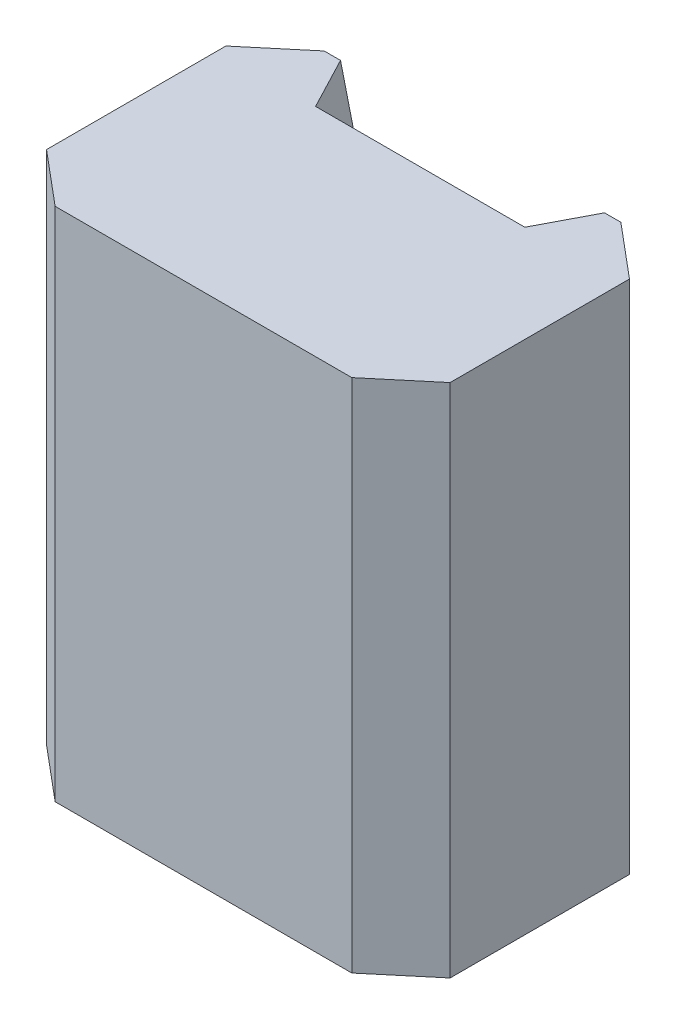
ISO-10303-21;
HEADER;
FILE_DESCRIPTION(('STEP AP214'),'2;1');
FILE_NAME('part.step','',(''),(''),'','','');
FILE_SCHEMA(('AUTOMOTIVE_DESIGN { 1 0 10303 214 1 1 1 1 }'));
ENDSEC;
DATA;
#1=APPLICATION_CONTEXT('core data for automotive mechanical design processes');
#2=APPLICATION_PROTOCOL_DEFINITION('international standard','automotive_design',2000,#1);
#3=PRODUCT_CONTEXT('',#1,'mechanical');
#4=PRODUCT('Part','Part','',(#3));
#5=PRODUCT_RELATED_PRODUCT_CATEGORY('part','',(#4));
#6=PRODUCT_DEFINITION_FORMATION('','',#4);
#7=PRODUCT_DEFINITION_CONTEXT('part definition',#1,'design');
#8=PRODUCT_DEFINITION('design','',#6,#7);
#9=PRODUCT_DEFINITION_SHAPE('','',#8);
#10=(LENGTH_UNIT() NAMED_UNIT(*) SI_UNIT(.MILLI.,.METRE.));
#11=(NAMED_UNIT(*) PLANE_ANGLE_UNIT() SI_UNIT($,.RADIAN.));
#12=(NAMED_UNIT(*) SI_UNIT($,.STERADIAN.) SOLID_ANGLE_UNIT());
#13=UNCERTAINTY_MEASURE_WITH_UNIT(LENGTH_MEASURE(1.E-05),#10,'distance_accuracy_value','');
#14=(GEOMETRIC_REPRESENTATION_CONTEXT(3) GLOBAL_UNCERTAINTY_ASSIGNED_CONTEXT((#13)) GLOBAL_UNIT_ASSIGNED_CONTEXT((#10,
#11,#12)) REPRESENTATION_CONTEXT('',''));
#15=CARTESIAN_POINT('',(0.,0.,0.));
#16=DIRECTION('',(0.,0.,1.));
#17=DIRECTION('',(1.,0.,0.));
#18=AXIS2_PLACEMENT_3D('',#15,#16,#17);
#19=CARTESIAN_POINT('',(135.,345.,90.));
#20=DIRECTION('',(-1.,0.,0.));
#21=DIRECTION('',(0.,0.,1.));
#22=AXIS2_PLACEMENT_3D('',#19,#20,#21);
#23=PLANE('',#22);
#24=DIRECTION('',(0.,0.,-1.));
#25=VECTOR('',#24,1.);
#26=CARTESIAN_POINT('',(135.,0.,90.));
#27=LINE('',#26,#25);
#28=CARTESIAN_POINT('',(135.,0.,60.));
#29=VERTEX_POINT('',#28);
#30=CARTESIAN_POINT('',(135.,0.,-59.9999999999999));
#31=VERTEX_POINT('',#30);
#32=EDGE_CURVE('E146',#29,#31,#27,.T.);
#33=ORIENTED_EDGE('',*,*,#32,.T.);
#34=DIRECTION('',(0.,1.,0.));
#35=VECTOR('',#34,1.);
#36=CARTESIAN_POINT('',(135.,345.,-60.));
#37=LINE('',#36,#35);
#38=CARTESIAN_POINT('',(135.,345.,-59.9999999999999));
#39=VERTEX_POINT('',#38);
#40=EDGE_CURVE('E175',#31,#39,#37,.T.);
#41=ORIENTED_EDGE('',*,*,#40,.T.);
#42=DIRECTION('',(0.,0.,-1.));
#43=VECTOR('',#42,1.);
#44=CARTESIAN_POINT('',(135.,345.,90.));
#45=LINE('',#44,#43);
#46=CARTESIAN_POINT('',(135.,345.,60.));
#47=VERTEX_POINT('',#46);
#48=EDGE_CURVE('E144',#47,#39,#45,.T.);
#49=ORIENTED_EDGE('',*,*,#48,.F.);
#50=DIRECTION('',(0.,-1.,0.));
#51=VECTOR('',#50,1.);
#52=CARTESIAN_POINT('',(135.,345.,60.));
#53=LINE('',#52,#51);
#54=EDGE_CURVE('E172',#47,#29,#53,.T.);
#55=ORIENTED_EDGE('',*,*,#54,.T.);
#56=EDGE_LOOP('',(#33,#41,#49,#55));
#57=FACE_BOUND('',#56,.T.);
#58=ADVANCED_FACE('F32',(#57),#23,.F.);
#59=CARTESIAN_POINT('',(-135.,345.,-90.));
#60=DIRECTION('',(0.,0.,1.));
#61=DIRECTION('',(1.,0.,0.));
#62=AXIS2_PLACEMENT_3D('',#59,#60,#61);
#63=PLANE('',#62);
#64=DIRECTION('',(-1.,0.,0.));
#65=VECTOR('',#64,1.);
#66=CARTESIAN_POINT('',(-135.,345.,-90.));
#67=LINE('',#66,#65);
#68=CARTESIAN_POINT('',(-88.3139965684988,345.,-90.));
#69=VERTEX_POINT('',#68);
#70=CARTESIAN_POINT('',(-99.2473922221738,345.,-90.));
#71=VERTEX_POINT('',#70);
#72=EDGE_CURVE('E46',#69,#71,#67,.T.);
#73=ORIENTED_EDGE('',*,*,#72,.F.);
#74=DIRECTION('',(-0.237044507396476,0.971498791308132,0.));
#75=VECTOR('',#74,1.);
#76=CARTESIAN_POINT('',(-90.9372876992717,355.751247480004,-90.));
#77=LINE('',#76,#75);
#78=CARTESIAN_POINT('',(-69.9999999999998,269.942257782166,-90.));
#79=VERTEX_POINT('',#78);
#80=EDGE_CURVE('E11',#69,#79,#77,.F.);
#81=ORIENTED_EDGE('',*,*,#80,.T.);
#82=DIRECTION('',(1.,0.,0.));
#83=VECTOR('',#82,1.);
#84=CARTESIAN_POINT('',(-135.,269.942257782166,-90.));
#85=LINE('',#84,#83);
#86=CARTESIAN_POINT('',(69.9999999999997,269.942257782166,-90.));
#87=VERTEX_POINT('',#86);
#88=EDGE_CURVE('E196',#79,#87,#85,.T.);
#89=ORIENTED_EDGE('',*,*,#88,.T.);
#90=DIRECTION('',(0.237044507396476,0.971498791308132,0.));
#91=VECTOR('',#90,1.);
#92=CARTESIAN_POINT('',(75.7659611078254,293.573365326089,-90.));
#93=LINE('',#92,#91);
#94=CARTESIAN_POINT('',(88.3139965684988,345.,-90.));
#95=VERTEX_POINT('',#94);
#96=EDGE_CURVE('E183',#87,#95,#93,.T.);
#97=ORIENTED_EDGE('',*,*,#96,.T.);
#98=CARTESIAN_POINT('',(99.2473922221738,345.,-90.));
#99=VERTEX_POINT('',#98);
#100=EDGE_CURVE('E54',#99,#95,#67,.T.);
#101=ORIENTED_EDGE('',*,*,#100,.F.);
#102=DIRECTION('',(0.,-1.,0.));
#103=VECTOR('',#102,1.);
#104=CARTESIAN_POINT('',(99.2473922221738,345.,-90.));
#105=LINE('',#104,#103);
#106=CARTESIAN_POINT('',(99.2473922221738,0.,-90.));
#107=VERTEX_POINT('',#106);
#108=EDGE_CURVE('E124',#99,#107,#105,.T.);
#109=ORIENTED_EDGE('',*,*,#108,.T.);
#110=DIRECTION('',(-1.,0.,0.));
#111=VECTOR('',#110,1.);
#112=CARTESIAN_POINT('',(-135.,0.,-90.));
#113=LINE('',#112,#111);
#114=CARTESIAN_POINT('',(-99.2473922221738,0.,-90.));
#115=VERTEX_POINT('',#114);
#116=EDGE_CURVE('E141',#107,#115,#113,.T.);
#117=ORIENTED_EDGE('',*,*,#116,.T.);
#118=DIRECTION('',(0.,1.,0.));
#119=VECTOR('',#118,1.);
#120=CARTESIAN_POINT('',(-99.2473922221738,345.,-90.));
#121=LINE('',#120,#119);
#122=EDGE_CURVE('E119',#115,#71,#121,.T.);
#123=ORIENTED_EDGE('',*,*,#122,.T.);
#124=EDGE_LOOP('',(#73,#81,#89,#97,#101,#109,#117,#123));
#125=FACE_BOUND('',#124,.T.);
#126=ADVANCED_FACE('F195',(#125),#63,.F.);
#127=CARTESIAN_POINT('',(-135.,345.,90.));
#128=DIRECTION('',(1.,0.,0.));
#129=DIRECTION('',(0.,0.,-1.));
#130=AXIS2_PLACEMENT_3D('',#127,#128,#129);
#131=PLANE('',#130);
#132=DIRECTION('',(0.,0.,1.));
#133=VECTOR('',#132,1.);
#134=CARTESIAN_POINT('',(-135.,345.,90.));
#135=LINE('',#134,#133);
#136=CARTESIAN_POINT('',(-135.,345.,-59.9999999999999));
#137=VERTEX_POINT('',#136);
#138=CARTESIAN_POINT('',(-135.,345.,60.));
#139=VERTEX_POINT('',#138);
#140=EDGE_CURVE('E134',#137,#139,#135,.T.);
#141=ORIENTED_EDGE('',*,*,#140,.F.);
#142=DIRECTION('',(0.,-1.,0.));
#143=VECTOR('',#142,1.);
#144=CARTESIAN_POINT('',(-135.,345.,-60.));
#145=LINE('',#144,#143);
#146=CARTESIAN_POINT('',(-135.,0.,-59.9999999999999));
#147=VERTEX_POINT('',#146);
#148=EDGE_CURVE('E118',#137,#147,#145,.T.);
#149=ORIENTED_EDGE('',*,*,#148,.T.);
#150=DIRECTION('',(0.,0.,1.));
#151=VECTOR('',#150,1.);
#152=CARTESIAN_POINT('',(-135.,0.,90.));
#153=LINE('',#152,#151);
#154=CARTESIAN_POINT('',(-135.,0.,60.));
#155=VERTEX_POINT('',#154);
#156=EDGE_CURVE('E131',#147,#155,#153,.T.);
#157=ORIENTED_EDGE('',*,*,#156,.T.);
#158=DIRECTION('',(0.,1.,0.));
#159=VECTOR('',#158,1.);
#160=CARTESIAN_POINT('',(-135.,345.,60.));
#161=LINE('',#160,#159);
#162=EDGE_CURVE('E136',#155,#139,#161,.T.);
#163=ORIENTED_EDGE('',*,*,#162,.T.);
#164=EDGE_LOOP('',(#141,#149,#157,#163));
#165=FACE_BOUND('',#164,.T.);
#166=ADVANCED_FACE('F130',(#165),#131,.F.);
#167=CARTESIAN_POINT('',(-135.,345.,90.));
#168=DIRECTION('',(0.,0.,-1.));
#169=DIRECTION('',(-1.,0.,0.));
#170=AXIS2_PLACEMENT_3D('',#167,#168,#169);
#171=PLANE('',#170);
#172=DIRECTION('',(1.,0.,0.));
#173=VECTOR('',#172,1.);
#174=CARTESIAN_POINT('',(-135.,345.,90.));
#175=LINE('',#174,#173);
#176=CARTESIAN_POINT('',(-99.2473922221738,345.,90.));
#177=VERTEX_POINT('',#176);
#178=CARTESIAN_POINT('',(99.2473922221738,345.,90.));
#179=VERTEX_POINT('',#178);
#180=EDGE_CURVE('E150',#177,#179,#175,.T.);
#181=ORIENTED_EDGE('',*,*,#180,.F.);
#182=DIRECTION('',(0.,-1.,0.));
#183=VECTOR('',#182,1.);
#184=CARTESIAN_POINT('',(-99.2473922221738,345.,90.));
#185=LINE('',#184,#183);
#186=CARTESIAN_POINT('',(-99.2473922221738,0.,90.));
#187=VERTEX_POINT('',#186);
#188=EDGE_CURVE('E169',#177,#187,#185,.T.);
#189=ORIENTED_EDGE('',*,*,#188,.T.);
#190=DIRECTION('',(1.,0.,0.));
#191=VECTOR('',#190,1.);
#192=CARTESIAN_POINT('',(-135.,0.,90.));
#193=LINE('',#192,#191);
#194=CARTESIAN_POINT('',(99.2473922221738,0.,90.));
#195=VERTEX_POINT('',#194);
#196=EDGE_CURVE('E140',#187,#195,#193,.T.);
#197=ORIENTED_EDGE('',*,*,#196,.T.);
#198=DIRECTION('',(0.,1.,0.));
#199=VECTOR('',#198,1.);
#200=CARTESIAN_POINT('',(99.2473922221738,345.,90.));
#201=LINE('',#200,#199);
#202=EDGE_CURVE('E167',#195,#179,#201,.T.);
#203=ORIENTED_EDGE('',*,*,#202,.T.);
#204=EDGE_LOOP('',(#181,#189,#197,#203));
#205=FACE_BOUND('',#204,.T.);
#206=ADVANCED_FACE('F279',(#205),#171,.F.);
#207=CARTESIAN_POINT('',(0.,345.,0.));
#208=DIRECTION('',(0.,-1.,0.));
#209=DIRECTION('',(0.,0.,-1.));
#210=AXIS2_PLACEMENT_3D('',#207,#208,#209);
#211=PLANE('',#210);
#212=DIRECTION('',(1.,0.,0.));
#213=VECTOR('',#212,1.);
#214=CARTESIAN_POINT('',(-90.,345.,-55.));
#215=LINE('',#214,#213);
#216=CARTESIAN_POINT('',(-69.9999999999998,345.,-55.));
#217=VERTEX_POINT('',#216);
#218=CARTESIAN_POINT('',(69.9999999999997,345.,-55.));
#219=VERTEX_POINT('',#218);
#220=EDGE_CURVE('E190',#217,#219,#215,.T.);
#221=ORIENTED_EDGE('',*,*,#220,.F.);
#222=DIRECTION('',(0.463622830290394,0.,0.886032658107772));
#223=VECTOR('',#222,1.);
#224=CARTESIAN_POINT('',(-32.360597708856,345.,16.932910725559));
#225=LINE('',#224,#223);
#226=EDGE_CURVE('E40',#217,#69,#225,.F.);
#227=ORIENTED_EDGE('',*,*,#226,.T.);
#228=ORIENTED_EDGE('',*,*,#72,.T.);
#229=DIRECTION('',(0.766044443118977,0.,-0.64278760968654));
#230=VECTOR('',#229,1.);
#231=CARTESIAN_POINT('',(-135.,345.,-60.));
#232=LINE('',#231,#230);
#233=EDGE_CURVE('E165',#71,#137,#232,.F.);
#234=ORIENTED_EDGE('',*,*,#233,.T.);
#235=ORIENTED_EDGE('',*,*,#140,.T.);
#236=DIRECTION('',(-0.766044443118977,0.,-0.64278760968654));
#237=VECTOR('',#236,1.);
#238=CARTESIAN_POINT('',(-99.2473922221738,345.,90.));
#239=LINE('',#238,#237);
#240=EDGE_CURVE('E163',#139,#177,#239,.F.);
#241=ORIENTED_EDGE('',*,*,#240,.T.);
#242=ORIENTED_EDGE('',*,*,#180,.T.);
#243=DIRECTION('',(-0.766044443118977,0.,0.64278760968654));
#244=VECTOR('',#243,1.);
#245=CARTESIAN_POINT('',(135.,345.,60.));
#246=LINE('',#245,#244);
#247=EDGE_CURVE('E159',#179,#47,#246,.F.);
#248=ORIENTED_EDGE('',*,*,#247,.T.);
#249=ORIENTED_EDGE('',*,*,#48,.T.);
#250=DIRECTION('',(0.766044443118977,0.,0.64278760968654));
#251=VECTOR('',#250,1.);
#252=CARTESIAN_POINT('',(99.2473922221738,345.,-90.));
#253=LINE('',#252,#251);
#254=EDGE_CURVE('E161',#39,#99,#253,.F.);
#255=ORIENTED_EDGE('',*,*,#254,.T.);
#256=ORIENTED_EDGE('',*,*,#100,.T.);
#257=DIRECTION('',(-0.463622830290394,0.,0.886032658107772));
#258=VECTOR('',#257,1.);
#259=CARTESIAN_POINT('',(32.360597708856,345.,16.932910725559));
#260=LINE('',#259,#258);
#261=EDGE_CURVE('E185',#95,#219,#260,.T.);
#262=ORIENTED_EDGE('',*,*,#261,.T.);
#263=EDGE_LOOP('',(#221,#227,#228,#234,#235,#241,#242,#248,#249,#255,#256,#262));
#264=FACE_BOUND('',#263,.T.);
#265=ADVANCED_FACE('F188',(#264),#211,.F.);
#266=CARTESIAN_POINT('',(0.,0.,0.));
#267=DIRECTION('',(0.,-1.,0.));
#268=DIRECTION('',(0.,0.,-1.));
#269=AXIS2_PLACEMENT_3D('',#266,#267,#268);
#270=PLANE('',#269);
#271=ORIENTED_EDGE('',*,*,#156,.F.);
#272=DIRECTION('',(-0.766044443118977,0.,0.64278760968654));
#273=VECTOR('',#272,1.);
#274=CARTESIAN_POINT('',(-85.3229805978486,0.,-101.683968658332));
#275=LINE('',#274,#273);
#276=EDGE_CURVE('E114',#147,#115,#275,.F.);
#277=ORIENTED_EDGE('',*,*,#276,.T.);
#278=ORIENTED_EDGE('',*,*,#116,.F.);
#279=DIRECTION('',(-0.766044443118977,0.,-0.64278760968654));
#280=VECTOR('',#279,1.);
#281=CARTESIAN_POINT('',(85.3229805978486,0.,-101.683968658332));
#282=LINE('',#281,#280);
#283=EDGE_CURVE('E153',#107,#31,#282,.F.);
#284=ORIENTED_EDGE('',*,*,#283,.T.);
#285=ORIENTED_EDGE('',*,*,#32,.F.);
#286=DIRECTION('',(0.766044443118977,0.,-0.64278760968654));
#287=VECTOR('',#286,1.);
#288=CARTESIAN_POINT('',(85.3229805978486,0.,101.683968658332));
#289=LINE('',#288,#287);
#290=EDGE_CURVE('E135',#29,#195,#289,.F.);
#291=ORIENTED_EDGE('',*,*,#290,.T.);
#292=ORIENTED_EDGE('',*,*,#196,.F.);
#293=DIRECTION('',(0.766044443118977,0.,0.64278760968654));
#294=VECTOR('',#293,1.);
#295=CARTESIAN_POINT('',(-85.3229805978486,0.,101.683968658332));
#296=LINE('',#295,#294);
#297=EDGE_CURVE('E125',#187,#155,#296,.F.);
#298=ORIENTED_EDGE('',*,*,#297,.T.);
#299=EDGE_LOOP('',(#271,#277,#278,#284,#285,#291,#292,#298));
#300=FACE_BOUND('',#299,.T.);
#301=ADVANCED_FACE('F138',(#300),#270,.T.);
#302=CARTESIAN_POINT('',(-135.,345.,-60.));
#303=DIRECTION('',(0.64278760968654,0.,0.766044443118977));
#304=DIRECTION('',(0.,-1.,0.));
#305=AXIS2_PLACEMENT_3D('',#302,#303,#304);
#306=PLANE('',#305);
#307=ORIENTED_EDGE('',*,*,#233,.F.);
#308=ORIENTED_EDGE('',*,*,#122,.F.);
#309=ORIENTED_EDGE('',*,*,#276,.F.);
#310=ORIENTED_EDGE('',*,*,#148,.F.);
#311=EDGE_LOOP('',(#307,#308,#309,#310));
#312=FACE_BOUND('',#311,.T.);
#313=ADVANCED_FACE('F117',(#312),#306,.F.);
#314=CARTESIAN_POINT('',(-99.2473922221738,345.,90.));
#315=DIRECTION('',(0.64278760968654,0.,-0.766044443118977));
#316=DIRECTION('',(0.,-1.,0.));
#317=AXIS2_PLACEMENT_3D('',#314,#315,#316);
#318=PLANE('',#317);
#319=ORIENTED_EDGE('',*,*,#240,.F.);
#320=ORIENTED_EDGE('',*,*,#162,.F.);
#321=ORIENTED_EDGE('',*,*,#297,.F.);
#322=ORIENTED_EDGE('',*,*,#188,.F.);
#323=EDGE_LOOP('',(#319,#320,#321,#322));
#324=FACE_BOUND('',#323,.T.);
#325=ADVANCED_FACE('F246',(#324),#318,.F.);
#326=CARTESIAN_POINT('',(99.2473922221738,345.,-90.));
#327=DIRECTION('',(-0.64278760968654,0.,0.766044443118977));
#328=DIRECTION('',(0.,-1.,0.));
#329=AXIS2_PLACEMENT_3D('',#326,#327,#328);
#330=PLANE('',#329);
#331=ORIENTED_EDGE('',*,*,#254,.F.);
#332=ORIENTED_EDGE('',*,*,#40,.F.);
#333=ORIENTED_EDGE('',*,*,#283,.F.);
#334=ORIENTED_EDGE('',*,*,#108,.F.);
#335=EDGE_LOOP('',(#331,#332,#333,#334));
#336=FACE_BOUND('',#335,.T.);
#337=ADVANCED_FACE('F225',(#336),#330,.F.);
#338=CARTESIAN_POINT('',(135.,345.,60.));
#339=DIRECTION('',(-0.64278760968654,0.,-0.766044443118977));
#340=DIRECTION('',(0.,-1.,0.));
#341=AXIS2_PLACEMENT_3D('',#338,#339,#340);
#342=PLANE('',#341);
#343=ORIENTED_EDGE('',*,*,#247,.F.);
#344=ORIENTED_EDGE('',*,*,#202,.F.);
#345=ORIENTED_EDGE('',*,*,#290,.F.);
#346=ORIENTED_EDGE('',*,*,#54,.F.);
#347=EDGE_LOOP('',(#343,#344,#345,#346));
#348=FACE_BOUND('',#347,.T.);
#349=ADVANCED_FACE('F218',(#348),#342,.F.);
#350=CARTESIAN_POINT('',(-90.,-83.9013841019063,-255.));
#351=DIRECTION('',(0.,-0.422618261740704,0.906307787036648));
#352=DIRECTION('',(0.,-0.906307787036648,-0.422618261740704));
#353=AXIS2_PLACEMENT_3D('',#350,#351,#352);
#354=PLANE('',#353);
#355=ORIENTED_EDGE('',*,*,#220,.T.);
#356=DIRECTION('',(0.,-0.906307787036648,-0.422618261740704));
#357=VECTOR('',#356,1.);
#358=CARTESIAN_POINT('',(69.9999999999998,-83.9013841019063,-255.));
#359=LINE('',#358,#357);
#360=EDGE_CURVE('E180',#219,#87,#359,.T.);
#361=ORIENTED_EDGE('',*,*,#360,.T.);
#362=ORIENTED_EDGE('',*,*,#88,.F.);
#363=DIRECTION('',(0.,0.906307787036648,0.422618261740704));
#364=VECTOR('',#363,1.);
#365=CARTESIAN_POINT('',(-69.9999999999998,345.,-55.));
#366=LINE('',#365,#364);
#367=EDGE_CURVE('E177',#79,#217,#366,.T.);
#368=ORIENTED_EDGE('',*,*,#367,.T.);
#369=EDGE_LOOP('',(#355,#361,#362,#368));
#370=FACE_BOUND('',#369,.T.);
#371=ADVANCED_FACE('F198',(#370),#354,.F.);
#372=CARTESIAN_POINT('',(69.9999999999998,-83.9013841019063,-255.));
#373=DIRECTION('',(0.866025403784441,-0.21130913087035,0.45315389351832));
#374=DIRECTION('',(0.,-0.906307787036648,-0.422618261740704));
#375=AXIS2_PLACEMENT_3D('',#372,#373,#374);
#376=PLANE('',#375);
#377=ORIENTED_EDGE('',*,*,#261,.F.);
#378=ORIENTED_EDGE('',*,*,#96,.F.);
#379=ORIENTED_EDGE('',*,*,#360,.F.);
#380=EDGE_LOOP('',(#377,#378,#379));
#381=FACE_BOUND('',#380,.T.);
#382=ADVANCED_FACE('F228',(#381),#376,.F.);
#383=CARTESIAN_POINT('',(-90.,97.3252855456725,-208.714748393261));
#384=DIRECTION('',(0.866025403784441,0.21130913087035,-0.45315389351832));
#385=DIRECTION('',(0.,0.906307787036648,0.422618261740704));
#386=AXIS2_PLACEMENT_3D('',#383,#384,#385);
#387=PLANE('',#386);
#388=ORIENTED_EDGE('',*,*,#226,.F.);
#389=ORIENTED_EDGE('',*,*,#367,.F.);
#390=ORIENTED_EDGE('',*,*,#80,.F.);
#391=EDGE_LOOP('',(#388,#389,#390));
#392=FACE_BOUND('',#391,.T.);
#393=ADVANCED_FACE('F34',(#392),#387,.T.);
#394=CLOSED_SHELL('',(#58,#126,#166,#206,#265,#301,#313,#325,#337,#349,#371,#382,#393));
#395=MANIFOLD_SOLID_BREP('B2',#394);
#396=ADVANCED_BREP_SHAPE_REPRESENTATION('',(#18,#395),#14);
#397=SHAPE_DEFINITION_REPRESENTATION(#9,#396);
ENDSEC;
END-ISO-10303-21;
